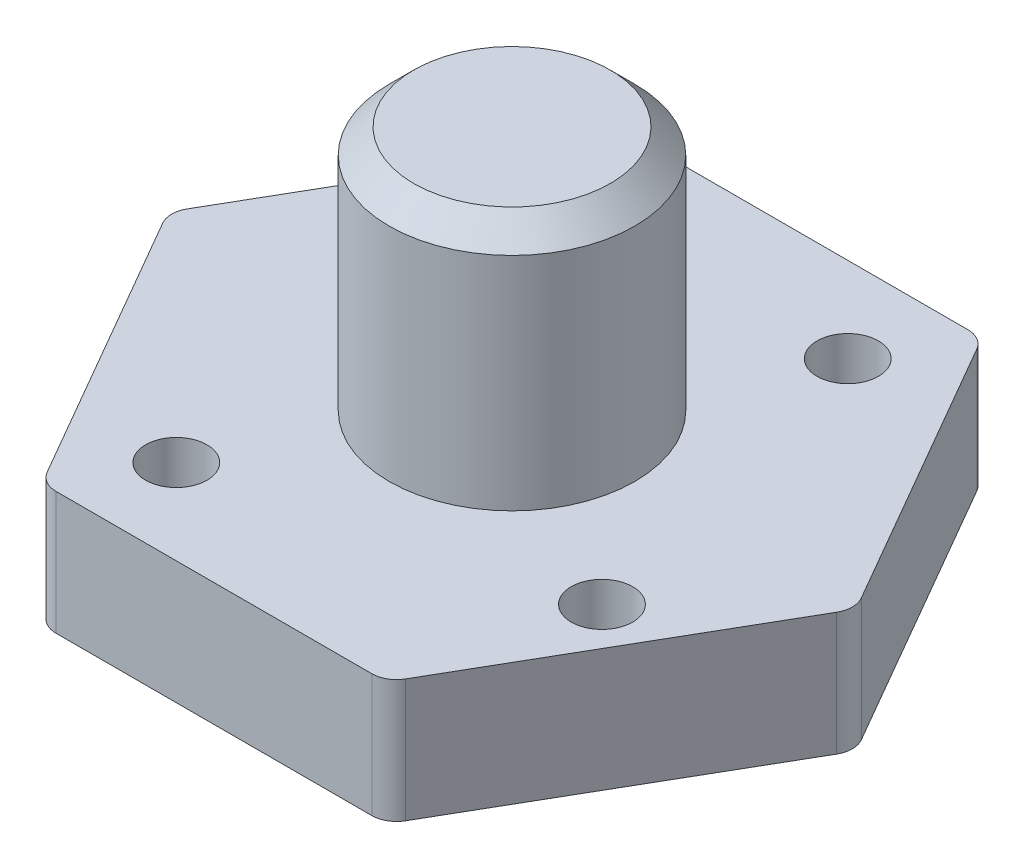
ISO-10303-21;
HEADER;
FILE_DESCRIPTION(('STEP AP214'),'2;1');
FILE_NAME('part.step','',(''),(''),'','','');
FILE_SCHEMA(('AUTOMOTIVE_DESIGN { 1 0 10303 214 1 1 1 1 }'));
ENDSEC;
DATA;
#1=APPLICATION_CONTEXT('core data for automotive mechanical design processes');
#2=APPLICATION_PROTOCOL_DEFINITION('international standard','automotive_design',2000,#1);
#3=PRODUCT_CONTEXT('',#1,'mechanical');
#4=PRODUCT('Part','Part','',(#3));
#5=PRODUCT_RELATED_PRODUCT_CATEGORY('part','',(#4));
#6=PRODUCT_DEFINITION_FORMATION('','',#4);
#7=PRODUCT_DEFINITION_CONTEXT('part definition',#1,'design');
#8=PRODUCT_DEFINITION('design','',#6,#7);
#9=PRODUCT_DEFINITION_SHAPE('','',#8);
#10=(LENGTH_UNIT() NAMED_UNIT(*) SI_UNIT(.MILLI.,.METRE.));
#11=(NAMED_UNIT(*) PLANE_ANGLE_UNIT() SI_UNIT($,.RADIAN.));
#12=(NAMED_UNIT(*) SI_UNIT($,.STERADIAN.) SOLID_ANGLE_UNIT());
#13=UNCERTAINTY_MEASURE_WITH_UNIT(LENGTH_MEASURE(1.E-05),#10,'distance_accuracy_value','');
#14=(GEOMETRIC_REPRESENTATION_CONTEXT(3) GLOBAL_UNCERTAINTY_ASSIGNED_CONTEXT((#13)) GLOBAL_UNIT_ASSIGNED_CONTEXT((#10,
#11,#12)) REPRESENTATION_CONTEXT('',''));
#15=CARTESIAN_POINT('',(0.,0.,0.));
#16=DIRECTION('',(0.,0.,1.));
#17=DIRECTION('',(1.,0.,0.));
#18=AXIS2_PLACEMENT_3D('',#15,#16,#17);
#19=CARTESIAN_POINT('',(0.,5.,0.));
#20=DIRECTION('',(0.,1.,0.));
#21=DIRECTION('',(0.,0.,1.));
#22=AXIS2_PLACEMENT_3D('',#19,#20,#21);
#23=PLANE('',#22);
#24=CARTESIAN_POINT('',(0.,5.,0.));
#25=DIRECTION('',(0.,1.,0.));
#26=DIRECTION('',(0.,0.,1.));
#27=AXIS2_PLACEMENT_3D('',#24,#25,#26);
#28=CIRCLE('',#27,5.);
#29=CARTESIAN_POINT('',(0.,5.,5.));
#30=VERTEX_POINT('',#29);
#31=EDGE_CURVE('E334',#30,#30,#28,.T.);
#32=ORIENTED_EDGE('',*,*,#31,.F.);
#33=EDGE_LOOP('',(#32));
#34=FACE_BOUND('',#33,.T.);
#35=CARTESIAN_POINT('',(-4.99999999999707,5.,8.66025403784609));
#36=DIRECTION('',(0.,1.,0.));
#37=DIRECTION('',(0.,0.,1.));
#38=AXIS2_PLACEMENT_3D('',#35,#36,#37);
#39=CIRCLE('',#38,1.25000000000235);
#40=CARTESIAN_POINT('',(-4.99999999999707,5.,9.91025403784844));
#41=VERTEX_POINT('',#40);
#42=EDGE_CURVE('E331',#41,#41,#39,.T.);
#43=ORIENTED_EDGE('',*,*,#42,.F.);
#44=EDGE_LOOP('',(#43));
#45=FACE_BOUND('',#44,.T.);
#46=CARTESIAN_POINT('',(5.,5.,-8.66025403784439));
#47=DIRECTION('',(0.,1.,0.));
#48=DIRECTION('',(0.,0.,1.));
#49=AXIS2_PLACEMENT_3D('',#46,#47,#48);
#50=CIRCLE('',#49,1.25);
#51=CARTESIAN_POINT('',(5.,5.,-7.41025403784438));
#52=VERTEX_POINT('',#51);
#53=EDGE_CURVE('E306',#52,#52,#50,.T.);
#54=ORIENTED_EDGE('',*,*,#53,.F.);
#55=EDGE_LOOP('',(#54));
#56=FACE_BOUND('',#55,.T.);
#57=DIRECTION('',(-1.,0.,0.));
#58=VECTOR('',#57,1.);
#59=CARTESIAN_POINT('',(6.99999999999997,5.,-12.1243556529822));
#60=LINE('',#59,#58);
#61=CARTESIAN_POINT('',(6.42264973081035,5.,-12.1243556529822));
#62=VERTEX_POINT('',#61);
#63=CARTESIAN_POINT('',(-6.42264973081039,5.,-12.1243556529822));
#64=VERTEX_POINT('',#63);
#65=EDGE_CURVE('E294',#62,#64,#60,.T.);
#66=ORIENTED_EDGE('',*,*,#65,.T.);
#67=CARTESIAN_POINT('',(-6.4226497308104,5.,-11.1243556529822));
#68=DIRECTION('',(0.,1.,0.));
#69=DIRECTION('',(0.,0.,1.));
#70=AXIS2_PLACEMENT_3D('',#67,#68,#69);
#71=CIRCLE('',#70,1.);
#72=CARTESIAN_POINT('',(-7.28867513459483,5.,-11.6243556529822));
#73=VERTEX_POINT('',#72);
#74=EDGE_CURVE('E193',#64,#73,#71,.T.);
#75=ORIENTED_EDGE('',*,*,#74,.T.);
#76=DIRECTION('',(-0.499999999999999,0.,0.866025403784439));
#77=VECTOR('',#76,1.);
#78=CARTESIAN_POINT('',(-7.00000000000002,5.,-12.1243556529822));
#79=LINE('',#78,#77);
#80=CARTESIAN_POINT('',(-13.7113248654052,5.,-0.500000000000007));
#81=VERTEX_POINT('',#80);
#82=EDGE_CURVE('E152',#73,#81,#79,.T.);
#83=ORIENTED_EDGE('',*,*,#82,.T.);
#84=CARTESIAN_POINT('',(-12.8452994616208,5.,0.));
#85=DIRECTION('',(0.,1.,0.));
#86=DIRECTION('',(0.,0.,1.));
#87=AXIS2_PLACEMENT_3D('',#84,#85,#86);
#88=CIRCLE('',#87,1.);
#89=CARTESIAN_POINT('',(-13.7113248654052,5.,0.499999999999993));
#90=VERTEX_POINT('',#89);
#91=EDGE_CURVE('E184',#81,#90,#88,.T.);
#92=ORIENTED_EDGE('',*,*,#91,.T.);
#93=DIRECTION('',(0.5,0.,0.866025403784439));
#94=VECTOR('',#93,1.);
#95=CARTESIAN_POINT('',(-14.,5.,0.));
#96=LINE('',#95,#94);
#97=CARTESIAN_POINT('',(-7.28867513459484,5.,11.6243556529822));
#98=VERTEX_POINT('',#97);
#99=EDGE_CURVE('E303',#90,#98,#96,.T.);
#100=ORIENTED_EDGE('',*,*,#99,.T.);
#101=CARTESIAN_POINT('',(-6.4226497308104,5.,11.1243556529822));
#102=DIRECTION('',(0.,1.,0.));
#103=DIRECTION('',(0.,0.,1.));
#104=AXIS2_PLACEMENT_3D('',#101,#102,#103);
#105=CIRCLE('',#104,1.);
#106=CARTESIAN_POINT('',(-6.4226497308104,5.,12.1243556529822));
#107=VERTEX_POINT('',#106);
#108=EDGE_CURVE('E63',#98,#107,#105,.T.);
#109=ORIENTED_EDGE('',*,*,#108,.T.);
#110=DIRECTION('',(1.,0.,0.));
#111=VECTOR('',#110,1.);
#112=CARTESIAN_POINT('',(-7.00000000000003,5.,12.1243556529822));
#113=LINE('',#112,#111);
#114=CARTESIAN_POINT('',(6.42264973081037,5.,12.1243556529822));
#115=VERTEX_POINT('',#114);
#116=EDGE_CURVE('E171',#107,#115,#113,.T.);
#117=ORIENTED_EDGE('',*,*,#116,.T.);
#118=CARTESIAN_POINT('',(6.42264973081037,5.,11.1243556529822));
#119=DIRECTION('',(0.,1.,0.));
#120=DIRECTION('',(0.,0.,1.));
#121=AXIS2_PLACEMENT_3D('',#118,#119,#120);
#122=CIRCLE('',#121,1.);
#123=CARTESIAN_POINT('',(7.28867513459481,5.,11.6243556529822));
#124=VERTEX_POINT('',#123);
#125=EDGE_CURVE('E187',#115,#124,#122,.T.);
#126=ORIENTED_EDGE('',*,*,#125,.T.);
#127=DIRECTION('',(0.499999999999999,0.,-0.866025403784439));
#128=VECTOR('',#127,1.);
#129=CARTESIAN_POINT('',(6.99999999999999,5.,12.1243556529822));
#130=LINE('',#129,#128);
#131=CARTESIAN_POINT('',(13.7113248654052,5.,0.499999999999997));
#132=VERTEX_POINT('',#131);
#133=EDGE_CURVE('E170',#124,#132,#130,.T.);
#134=ORIENTED_EDGE('',*,*,#133,.T.);
#135=CARTESIAN_POINT('',(12.8452994616207,5.,0.));
#136=DIRECTION('',(0.,1.,0.));
#137=DIRECTION('',(0.,0.,1.));
#138=AXIS2_PLACEMENT_3D('',#135,#136,#137);
#139=CIRCLE('',#138,1.);
#140=CARTESIAN_POINT('',(13.7113248654052,5.,-0.500000000000004));
#141=VERTEX_POINT('',#140);
#142=EDGE_CURVE('E189',#132,#141,#139,.T.);
#143=ORIENTED_EDGE('',*,*,#142,.T.);
#144=DIRECTION('',(-0.5,0.,-0.866025403784439));
#145=VECTOR('',#144,1.);
#146=CARTESIAN_POINT('',(14.,5.,0.));
#147=LINE('',#146,#145);
#148=CARTESIAN_POINT('',(7.28867513459478,5.,-11.6243556529822));
#149=VERTEX_POINT('',#148);
#150=EDGE_CURVE('E291',#141,#149,#147,.T.);
#151=ORIENTED_EDGE('',*,*,#150,.T.);
#152=CARTESIAN_POINT('',(6.42264973081035,5.,-11.1243556529822));
#153=DIRECTION('',(0.,1.,0.));
#154=DIRECTION('',(0.,0.,1.));
#155=AXIS2_PLACEMENT_3D('',#152,#153,#154);
#156=CIRCLE('',#155,1.);
#157=EDGE_CURVE('E191',#149,#62,#156,.T.);
#158=ORIENTED_EDGE('',*,*,#157,.T.);
#159=EDGE_LOOP('',(#66,#75,#83,#92,#100,#109,#117,#126,#134,#143,#151,#158));
#160=FACE_BOUND('',#159,.T.);
#161=CARTESIAN_POINT('',(8.6602540378467,5.,4.99999999999939));
#162=DIRECTION('',(0.,1.,0.));
#163=DIRECTION('',(0.,0.,1.));
#164=AXIS2_PLACEMENT_3D('',#161,#162,#163);
#165=CIRCLE('',#164,1.24999999999993);
#166=CARTESIAN_POINT('',(8.6602540378467,5.,6.24999999999932));
#167=VERTEX_POINT('',#166);
#168=EDGE_CURVE('E322',#167,#167,#165,.T.);
#169=ORIENTED_EDGE('',*,*,#168,.F.);
#170=EDGE_LOOP('',(#169));
#171=FACE_BOUND('',#170,.T.);
#172=CARTESIAN_POINT('',(-8.66025403784378,5.,-4.99999999999768));
#173=DIRECTION('',(0.,1.,0.));
#174=DIRECTION('',(0.,0.,1.));
#175=AXIS2_PLACEMENT_3D('',#172,#173,#174);
#176=CIRCLE('',#175,1.25000000000247);
#177=CARTESIAN_POINT('',(-8.66025403784378,5.,-3.74999999999521));
#178=VERTEX_POINT('',#177);
#179=EDGE_CURVE('E325',#178,#178,#176,.T.);
#180=ORIENTED_EDGE('',*,*,#179,.F.);
#181=EDGE_LOOP('',(#180));
#182=FACE_BOUND('',#181,.T.);
#183=ADVANCED_FACE('F40',(#34,#45,#56,#160,#171,#182),#23,.T.);
#184=CARTESIAN_POINT('',(0.,0.,0.));
#185=DIRECTION('',(0.,1.,0.));
#186=DIRECTION('',(0.,0.,1.));
#187=AXIS2_PLACEMENT_3D('',#184,#185,#186);
#188=PLANE('',#187);
#189=DIRECTION('',(-0.499999999999999,0.,0.866025403784439));
#190=VECTOR('',#189,1.);
#191=CARTESIAN_POINT('',(-7.00000000000002,0.,-12.1243556529822));
#192=LINE('',#191,#190);
#193=CARTESIAN_POINT('',(-7.28867513459483,0.,-11.6243556529822));
#194=VERTEX_POINT('',#193);
#195=CARTESIAN_POINT('',(-13.7113248654052,0.,-0.500000000000007));
#196=VERTEX_POINT('',#195);
#197=EDGE_CURVE('E149',#194,#196,#192,.T.);
#198=ORIENTED_EDGE('',*,*,#197,.F.);
#199=CARTESIAN_POINT('',(-6.4226497308104,0.,-11.1243556529822));
#200=DIRECTION('',(0.,1.,0.));
#201=DIRECTION('',(0.,0.,1.));
#202=AXIS2_PLACEMENT_3D('',#199,#200,#201);
#203=CIRCLE('',#202,1.);
#204=CARTESIAN_POINT('',(-6.42264973081039,0.,-12.1243556529822));
#205=VERTEX_POINT('',#204);
#206=EDGE_CURVE('E132',#194,#205,#203,.F.);
#207=ORIENTED_EDGE('',*,*,#206,.T.);
#208=DIRECTION('',(-1.,0.,0.));
#209=VECTOR('',#208,1.);
#210=CARTESIAN_POINT('',(6.99999999999997,0.,-12.1243556529822));
#211=LINE('',#210,#209);
#212=CARTESIAN_POINT('',(6.42264973081035,0.,-12.1243556529822));
#213=VERTEX_POINT('',#212);
#214=EDGE_CURVE('E160',#213,#205,#211,.T.);
#215=ORIENTED_EDGE('',*,*,#214,.F.);
#216=CARTESIAN_POINT('',(6.42264973081035,0.,-11.1243556529822));
#217=DIRECTION('',(0.,1.,0.));
#218=DIRECTION('',(0.,0.,1.));
#219=AXIS2_PLACEMENT_3D('',#216,#217,#218);
#220=CIRCLE('',#219,1.);
#221=CARTESIAN_POINT('',(7.28867513459478,0.,-11.6243556529822));
#222=VERTEX_POINT('',#221);
#223=EDGE_CURVE('E143',#213,#222,#220,.F.);
#224=ORIENTED_EDGE('',*,*,#223,.T.);
#225=DIRECTION('',(-0.5,0.,-0.866025403784439));
#226=VECTOR('',#225,1.);
#227=CARTESIAN_POINT('',(14.,0.,0.));
#228=LINE('',#227,#226);
#229=CARTESIAN_POINT('',(13.7113248654052,0.,-0.500000000000004));
#230=VERTEX_POINT('',#229);
#231=EDGE_CURVE('E165',#230,#222,#228,.T.);
#232=ORIENTED_EDGE('',*,*,#231,.F.);
#233=CARTESIAN_POINT('',(12.8452994616207,0.,0.));
#234=DIRECTION('',(0.,1.,0.));
#235=DIRECTION('',(0.,0.,1.));
#236=AXIS2_PLACEMENT_3D('',#233,#234,#235);
#237=CIRCLE('',#236,1.);
#238=CARTESIAN_POINT('',(13.7113248654052,0.,0.499999999999997));
#239=VERTEX_POINT('',#238);
#240=EDGE_CURVE('E178',#230,#239,#237,.F.);
#241=ORIENTED_EDGE('',*,*,#240,.T.);
#242=DIRECTION('',(0.499999999999999,0.,-0.866025403784439));
#243=VECTOR('',#242,1.);
#244=CARTESIAN_POINT('',(6.99999999999999,0.,12.1243556529822));
#245=LINE('',#244,#243);
#246=CARTESIAN_POINT('',(7.28867513459481,0.,11.6243556529822));
#247=VERTEX_POINT('',#246);
#248=EDGE_CURVE('E284',#247,#239,#245,.T.);
#249=ORIENTED_EDGE('',*,*,#248,.F.);
#250=CARTESIAN_POINT('',(6.42264973081037,0.,11.1243556529822));
#251=DIRECTION('',(0.,1.,0.));
#252=DIRECTION('',(0.,0.,1.));
#253=AXIS2_PLACEMENT_3D('',#250,#251,#252);
#254=CIRCLE('',#253,1.);
#255=CARTESIAN_POINT('',(6.42264973081037,0.,12.1243556529822));
#256=VERTEX_POINT('',#255);
#257=EDGE_CURVE('E176',#247,#256,#254,.F.);
#258=ORIENTED_EDGE('',*,*,#257,.T.);
#259=DIRECTION('',(1.,0.,0.));
#260=VECTOR('',#259,1.);
#261=CARTESIAN_POINT('',(-7.00000000000003,0.,12.1243556529822));
#262=LINE('',#261,#260);
#263=CARTESIAN_POINT('',(-6.4226497308104,0.,12.1243556529822));
#264=VERTEX_POINT('',#263);
#265=EDGE_CURVE('E163',#264,#256,#262,.T.);
#266=ORIENTED_EDGE('',*,*,#265,.F.);
#267=CARTESIAN_POINT('',(-6.4226497308104,0.,11.1243556529822));
#268=DIRECTION('',(0.,1.,0.));
#269=DIRECTION('',(0.,0.,1.));
#270=AXIS2_PLACEMENT_3D('',#267,#268,#269);
#271=CIRCLE('',#270,1.);
#272=CARTESIAN_POINT('',(-7.28867513459484,0.,11.6243556529822));
#273=VERTEX_POINT('',#272);
#274=EDGE_CURVE('E174',#264,#273,#271,.F.);
#275=ORIENTED_EDGE('',*,*,#274,.T.);
#276=DIRECTION('',(0.5,0.,0.866025403784439));
#277=VECTOR('',#276,1.);
#278=CARTESIAN_POINT('',(-14.,0.,0.));
#279=LINE('',#278,#277);
#280=CARTESIAN_POINT('',(-13.7113248654052,0.,0.499999999999993));
#281=VERTEX_POINT('',#280);
#282=EDGE_CURVE('E159',#281,#273,#279,.T.);
#283=ORIENTED_EDGE('',*,*,#282,.F.);
#284=CARTESIAN_POINT('',(-12.8452994616208,0.,0.));
#285=DIRECTION('',(0.,1.,0.));
#286=DIRECTION('',(0.,0.,1.));
#287=AXIS2_PLACEMENT_3D('',#284,#285,#286);
#288=CIRCLE('',#287,1.);
#289=EDGE_CURVE('E153',#281,#196,#288,.F.);
#290=ORIENTED_EDGE('',*,*,#289,.T.);
#291=EDGE_LOOP('',(#198,#207,#215,#224,#232,#241,#249,#258,#266,#275,#283,#290));
#292=FACE_BOUND('',#291,.T.);
#293=CARTESIAN_POINT('',(5.,0.,-8.66025403784439));
#294=DIRECTION('',(0.,1.,0.));
#295=DIRECTION('',(0.,0.,1.));
#296=AXIS2_PLACEMENT_3D('',#293,#294,#295);
#297=CIRCLE('',#296,1.25);
#298=CARTESIAN_POINT('',(5.,0.,-7.41025403784438));
#299=VERTEX_POINT('',#298);
#300=EDGE_CURVE('E297',#299,#299,#297,.T.);
#301=ORIENTED_EDGE('',*,*,#300,.T.);
#302=EDGE_LOOP('',(#301));
#303=FACE_BOUND('',#302,.T.);
#304=CARTESIAN_POINT('',(8.6602540378467,0.,4.99999999999939));
#305=DIRECTION('',(0.,1.,0.));
#306=DIRECTION('',(0.,0.,1.));
#307=AXIS2_PLACEMENT_3D('',#304,#305,#306);
#308=CIRCLE('',#307,1.24999999999993);
#309=CARTESIAN_POINT('',(8.6602540378467,0.,6.24999999999932));
#310=VERTEX_POINT('',#309);
#311=EDGE_CURVE('E339',#310,#310,#308,.T.);
#312=ORIENTED_EDGE('',*,*,#311,.T.);
#313=EDGE_LOOP('',(#312));
#314=FACE_BOUND('',#313,.T.);
#315=CARTESIAN_POINT('',(-4.99999999999707,0.,8.66025403784609));
#316=DIRECTION('',(0.,1.,0.));
#317=DIRECTION('',(0.,0.,1.));
#318=AXIS2_PLACEMENT_3D('',#315,#316,#317);
#319=CIRCLE('',#318,1.25000000000235);
#320=CARTESIAN_POINT('',(-4.99999999999707,0.,9.91025403784844));
#321=VERTEX_POINT('',#320);
#322=EDGE_CURVE('E327',#321,#321,#319,.T.);
#323=ORIENTED_EDGE('',*,*,#322,.T.);
#324=EDGE_LOOP('',(#323));
#325=FACE_BOUND('',#324,.T.);
#326=CARTESIAN_POINT('',(-8.66025403784378,0.,-4.99999999999768));
#327=DIRECTION('',(0.,1.,0.));
#328=DIRECTION('',(0.,0.,1.));
#329=AXIS2_PLACEMENT_3D('',#326,#327,#328);
#330=CIRCLE('',#329,1.25000000000247);
#331=CARTESIAN_POINT('',(-8.66025403784378,0.,-3.74999999999521));
#332=VERTEX_POINT('',#331);
#333=EDGE_CURVE('E328',#332,#332,#330,.T.);
#334=ORIENTED_EDGE('',*,*,#333,.T.);
#335=EDGE_LOOP('',(#334));
#336=FACE_BOUND('',#335,.T.);
#337=ADVANCED_FACE('F156',(#292,#303,#314,#325,#336),#188,.F.);
#338=CARTESIAN_POINT('',(6.99999999999999,5.,12.1243556529822));
#339=DIRECTION('',(-0.866025403784439,0.,-0.5));
#340=DIRECTION('',(-0.5,0.,0.866025403784439));
#341=AXIS2_PLACEMENT_3D('',#338,#339,#340);
#342=PLANE('',#341);
#343=ORIENTED_EDGE('',*,*,#248,.T.);
#344=DIRECTION('',(0.,-1.,0.));
#345=VECTOR('',#344,1.);
#346=CARTESIAN_POINT('',(13.7113248654052,5.,0.499999999999997));
#347=LINE('',#346,#345);
#348=EDGE_CURVE('E203',#239,#132,#347,.F.);
#349=ORIENTED_EDGE('',*,*,#348,.T.);
#350=ORIENTED_EDGE('',*,*,#133,.F.);
#351=DIRECTION('',(0.,-1.,0.));
#352=VECTOR('',#351,1.);
#353=CARTESIAN_POINT('',(7.28867513459481,5.,11.6243556529822));
#354=LINE('',#353,#352);
#355=EDGE_CURVE('E200',#124,#247,#354,.T.);
#356=ORIENTED_EDGE('',*,*,#355,.T.);
#357=EDGE_LOOP('',(#343,#349,#350,#356));
#358=FACE_BOUND('',#357,.T.);
#359=ADVANCED_FACE('F233',(#358),#342,.F.);
#360=CARTESIAN_POINT('',(14.,5.,0.));
#361=DIRECTION('',(-0.866025403784439,0.,0.5));
#362=DIRECTION('',(0.5,0.,0.866025403784439));
#363=AXIS2_PLACEMENT_3D('',#360,#361,#362);
#364=PLANE('',#363);
#365=ORIENTED_EDGE('',*,*,#231,.T.);
#366=DIRECTION('',(0.,-1.,0.));
#367=VECTOR('',#366,1.);
#368=CARTESIAN_POINT('',(7.28867513459478,5.,-11.6243556529822));
#369=LINE('',#368,#367);
#370=EDGE_CURVE('E198',#222,#149,#369,.F.);
#371=ORIENTED_EDGE('',*,*,#370,.T.);
#372=ORIENTED_EDGE('',*,*,#150,.F.);
#373=DIRECTION('',(0.,-1.,0.));
#374=VECTOR('',#373,1.);
#375=CARTESIAN_POINT('',(13.7113248654052,5.,-0.500000000000004));
#376=LINE('',#375,#374);
#377=EDGE_CURVE('E195',#141,#230,#376,.T.);
#378=ORIENTED_EDGE('',*,*,#377,.T.);
#379=EDGE_LOOP('',(#365,#371,#372,#378));
#380=FACE_BOUND('',#379,.T.);
#381=ADVANCED_FACE('F253',(#380),#364,.F.);
#382=CARTESIAN_POINT('',(6.99999999999997,5.,-12.1243556529822));
#383=DIRECTION('',(0.,0.,1.));
#384=DIRECTION('',(1.,0.,0.));
#385=AXIS2_PLACEMENT_3D('',#382,#383,#384);
#386=PLANE('',#385);
#387=ORIENTED_EDGE('',*,*,#214,.T.);
#388=DIRECTION('',(0.,-1.,0.));
#389=VECTOR('',#388,1.);
#390=CARTESIAN_POINT('',(-6.42264973081039,5.,-12.1243556529822));
#391=LINE('',#390,#389);
#392=EDGE_CURVE('E137',#205,#64,#391,.F.);
#393=ORIENTED_EDGE('',*,*,#392,.T.);
#394=ORIENTED_EDGE('',*,*,#65,.F.);
#395=DIRECTION('',(0.,-1.,0.));
#396=VECTOR('',#395,1.);
#397=CARTESIAN_POINT('',(6.42264973081035,5.,-12.1243556529822));
#398=LINE('',#397,#396);
#399=EDGE_CURVE('E142',#62,#213,#398,.T.);
#400=ORIENTED_EDGE('',*,*,#399,.T.);
#401=EDGE_LOOP('',(#387,#393,#394,#400));
#402=FACE_BOUND('',#401,.T.);
#403=ADVANCED_FACE('F250',(#402),#386,.F.);
#404=CARTESIAN_POINT('',(-7.00000000000002,5.,-12.1243556529822));
#405=DIRECTION('',(0.866025403784439,0.,0.5));
#406=DIRECTION('',(0.5,0.,-0.866025403784439));
#407=AXIS2_PLACEMENT_3D('',#404,#405,#406);
#408=PLANE('',#407);
#409=ORIENTED_EDGE('',*,*,#82,.F.);
#410=DIRECTION('',(0.,-1.,0.));
#411=VECTOR('',#410,1.);
#412=CARTESIAN_POINT('',(-7.28867513459483,5.,-11.6243556529822));
#413=LINE('',#412,#411);
#414=EDGE_CURVE('E136',#73,#194,#413,.T.);
#415=ORIENTED_EDGE('',*,*,#414,.T.);
#416=ORIENTED_EDGE('',*,*,#197,.T.);
#417=DIRECTION('',(0.,-1.,0.));
#418=VECTOR('',#417,1.);
#419=CARTESIAN_POINT('',(-13.7113248654052,5.,-0.500000000000007));
#420=LINE('',#419,#418);
#421=EDGE_CURVE('E154',#196,#81,#420,.F.);
#422=ORIENTED_EDGE('',*,*,#421,.T.);
#423=EDGE_LOOP('',(#409,#415,#416,#422));
#424=FACE_BOUND('',#423,.T.);
#425=ADVANCED_FACE('F148',(#424),#408,.F.);
#426=CARTESIAN_POINT('',(-14.,5.,0.));
#427=DIRECTION('',(0.866025403784439,0.,-0.5));
#428=DIRECTION('',(-0.5,0.,-0.866025403784439));
#429=AXIS2_PLACEMENT_3D('',#426,#427,#428);
#430=PLANE('',#429);
#431=ORIENTED_EDGE('',*,*,#282,.T.);
#432=DIRECTION('',(0.,-1.,0.));
#433=VECTOR('',#432,1.);
#434=CARTESIAN_POINT('',(-7.28867513459484,5.,11.6243556529822));
#435=LINE('',#434,#433);
#436=EDGE_CURVE('E212',#273,#98,#435,.F.);
#437=ORIENTED_EDGE('',*,*,#436,.T.);
#438=ORIENTED_EDGE('',*,*,#99,.F.);
#439=DIRECTION('',(0.,-1.,0.));
#440=VECTOR('',#439,1.);
#441=CARTESIAN_POINT('',(-13.7113248654052,5.,0.499999999999993));
#442=LINE('',#441,#440);
#443=EDGE_CURVE('E209',#90,#281,#442,.T.);
#444=ORIENTED_EDGE('',*,*,#443,.T.);
#445=EDGE_LOOP('',(#431,#437,#438,#444));
#446=FACE_BOUND('',#445,.T.);
#447=ADVANCED_FACE('F244',(#446),#430,.F.);
#448=CARTESIAN_POINT('',(-7.00000000000003,5.,12.1243556529822));
#449=DIRECTION('',(0.,0.,-1.));
#450=DIRECTION('',(-1.,0.,0.));
#451=AXIS2_PLACEMENT_3D('',#448,#449,#450);
#452=PLANE('',#451);
#453=ORIENTED_EDGE('',*,*,#265,.T.);
#454=DIRECTION('',(0.,-1.,0.));
#455=VECTOR('',#454,1.);
#456=CARTESIAN_POINT('',(6.42264973081037,5.,12.1243556529822));
#457=LINE('',#456,#455);
#458=EDGE_CURVE('E56',#256,#115,#457,.F.);
#459=ORIENTED_EDGE('',*,*,#458,.T.);
#460=ORIENTED_EDGE('',*,*,#116,.F.);
#461=DIRECTION('',(0.,-1.,0.));
#462=VECTOR('',#461,1.);
#463=CARTESIAN_POINT('',(-6.4226497308104,5.,12.1243556529822));
#464=LINE('',#463,#462);
#465=EDGE_CURVE('E205',#107,#264,#464,.T.);
#466=ORIENTED_EDGE('',*,*,#465,.T.);
#467=EDGE_LOOP('',(#453,#459,#460,#466));
#468=FACE_BOUND('',#467,.T.);
#469=ADVANCED_FACE('F241',(#468),#452,.F.);
#470=CARTESIAN_POINT('',(5.,5.,-8.66025403784439));
#471=DIRECTION('',(0.,-1.,0.));
#472=DIRECTION('',(0.,0.,-1.));
#473=AXIS2_PLACEMENT_3D('',#470,#471,#472);
#474=CYLINDRICAL_SURFACE('',#473,1.25);
#475=ORIENTED_EDGE('',*,*,#53,.T.);
#476=EDGE_LOOP('',(#475));
#477=FACE_BOUND('',#476,.T.);
#478=ORIENTED_EDGE('',*,*,#300,.F.);
#479=EDGE_LOOP('',(#478));
#480=FACE_BOUND('',#479,.T.);
#481=ADVANCED_FACE('F238',(#477,#480),#474,.F.);
#482=CARTESIAN_POINT('',(8.6602540378467,5.,4.99999999999939));
#483=DIRECTION('',(0.,-1.,0.));
#484=DIRECTION('',(0.,0.,-1.));
#485=AXIS2_PLACEMENT_3D('',#482,#483,#484);
#486=CYLINDRICAL_SURFACE('',#485,1.24999999999993);
#487=ORIENTED_EDGE('',*,*,#168,.T.);
#488=EDGE_LOOP('',(#487));
#489=FACE_BOUND('',#488,.T.);
#490=ORIENTED_EDGE('',*,*,#311,.F.);
#491=EDGE_LOOP('',(#490));
#492=FACE_BOUND('',#491,.T.);
#493=ADVANCED_FACE('F351',(#489,#492),#486,.F.);
#494=CARTESIAN_POINT('',(-4.99999999999707,5.,8.66025403784609));
#495=DIRECTION('',(0.,-1.,0.));
#496=DIRECTION('',(0.,0.,-1.));
#497=AXIS2_PLACEMENT_3D('',#494,#495,#496);
#498=CYLINDRICAL_SURFACE('',#497,1.25000000000235);
#499=ORIENTED_EDGE('',*,*,#42,.T.);
#500=EDGE_LOOP('',(#499));
#501=FACE_BOUND('',#500,.T.);
#502=ORIENTED_EDGE('',*,*,#322,.F.);
#503=EDGE_LOOP('',(#502));
#504=FACE_BOUND('',#503,.T.);
#505=ADVANCED_FACE('F355',(#501,#504),#498,.F.);
#506=CARTESIAN_POINT('',(-8.66025403784378,5.,-4.99999999999768));
#507=DIRECTION('',(0.,-1.,0.));
#508=DIRECTION('',(0.,0.,-1.));
#509=AXIS2_PLACEMENT_3D('',#506,#507,#508);
#510=CYLINDRICAL_SURFACE('',#509,1.25000000000247);
#511=ORIENTED_EDGE('',*,*,#179,.T.);
#512=EDGE_LOOP('',(#511));
#513=FACE_BOUND('',#512,.T.);
#514=ORIENTED_EDGE('',*,*,#333,.F.);
#515=EDGE_LOOP('',(#514));
#516=FACE_BOUND('',#515,.T.);
#517=ADVANCED_FACE('F360',(#513,#516),#510,.F.);
#518=CARTESIAN_POINT('',(0.,15.,0.));
#519=DIRECTION('',(0.,-1.,0.));
#520=DIRECTION('',(0.,0.,-1.));
#521=AXIS2_PLACEMENT_3D('',#518,#519,#520);
#522=CYLINDRICAL_SURFACE('',#521,5.);
#523=CARTESIAN_POINT('',(0.,14.,0.));
#524=DIRECTION('',(0.,1.,0.));
#525=DIRECTION('',(0.,0.,1.));
#526=AXIS2_PLACEMENT_3D('',#523,#524,#525);
#527=CIRCLE('',#526,5.);
#528=CARTESIAN_POINT('',(0.,14.,5.));
#529=VERTEX_POINT('',#528);
#530=EDGE_CURVE('E11',#529,#529,#527,.F.);
#531=ORIENTED_EDGE('',*,*,#530,.T.);
#532=EDGE_LOOP('',(#531));
#533=FACE_BOUND('',#532,.T.);
#534=ORIENTED_EDGE('',*,*,#31,.T.);
#535=EDGE_LOOP('',(#534));
#536=FACE_BOUND('',#535,.T.);
#537=ADVANCED_FACE('F367',(#533,#536),#522,.T.);
#538=CARTESIAN_POINT('',(0.,15.,0.));
#539=DIRECTION('',(0.,1.,0.));
#540=DIRECTION('',(0.,0.,1.));
#541=AXIS2_PLACEMENT_3D('',#538,#539,#540);
#542=PLANE('',#541);
#543=CARTESIAN_POINT('',(0.,15.,0.));
#544=DIRECTION('',(0.,1.,0.));
#545=DIRECTION('',(0.,0.,1.));
#546=AXIS2_PLACEMENT_3D('',#543,#544,#545);
#547=CIRCLE('',#546,4.);
#548=CARTESIAN_POINT('',(0.,15.,4.));
#549=VERTEX_POINT('',#548);
#550=EDGE_CURVE('E49',#549,#549,#547,.T.);
#551=ORIENTED_EDGE('',*,*,#550,.T.);
#552=EDGE_LOOP('',(#551));
#553=FACE_BOUND('',#552,.T.);
#554=ADVANCED_FACE('F216',(#553),#542,.T.);
#555=CARTESIAN_POINT('',(-6.4226497308104,5.,-11.1243556529822));
#556=DIRECTION('',(0.,-1.,0.));
#557=DIRECTION('',(0.,0.,-1.));
#558=AXIS2_PLACEMENT_3D('',#555,#556,#557);
#559=CYLINDRICAL_SURFACE('',#558,1.);
#560=ORIENTED_EDGE('',*,*,#74,.F.);
#561=ORIENTED_EDGE('',*,*,#392,.F.);
#562=ORIENTED_EDGE('',*,*,#206,.F.);
#563=ORIENTED_EDGE('',*,*,#414,.F.);
#564=EDGE_LOOP('',(#560,#561,#562,#563));
#565=FACE_BOUND('',#564,.T.);
#566=ADVANCED_FACE('F135',(#565),#559,.T.);
#567=CARTESIAN_POINT('',(6.42264973081035,5.,-11.1243556529822));
#568=DIRECTION('',(0.,-1.,0.));
#569=DIRECTION('',(0.,0.,-1.));
#570=AXIS2_PLACEMENT_3D('',#567,#568,#569);
#571=CYLINDRICAL_SURFACE('',#570,1.);
#572=ORIENTED_EDGE('',*,*,#157,.F.);
#573=ORIENTED_EDGE('',*,*,#370,.F.);
#574=ORIENTED_EDGE('',*,*,#223,.F.);
#575=ORIENTED_EDGE('',*,*,#399,.F.);
#576=EDGE_LOOP('',(#572,#573,#574,#575));
#577=FACE_BOUND('',#576,.T.);
#578=ADVANCED_FACE('F263',(#577),#571,.T.);
#579=CARTESIAN_POINT('',(12.8452994616207,5.,0.));
#580=DIRECTION('',(0.,-1.,0.));
#581=DIRECTION('',(0.,0.,-1.));
#582=AXIS2_PLACEMENT_3D('',#579,#580,#581);
#583=CYLINDRICAL_SURFACE('',#582,1.);
#584=ORIENTED_EDGE('',*,*,#142,.F.);
#585=ORIENTED_EDGE('',*,*,#348,.F.);
#586=ORIENTED_EDGE('',*,*,#240,.F.);
#587=ORIENTED_EDGE('',*,*,#377,.F.);
#588=EDGE_LOOP('',(#584,#585,#586,#587));
#589=FACE_BOUND('',#588,.T.);
#590=ADVANCED_FACE('F266',(#589),#583,.T.);
#591=CARTESIAN_POINT('',(6.42264973081037,5.,11.1243556529822));
#592=DIRECTION('',(0.,-1.,0.));
#593=DIRECTION('',(0.,0.,-1.));
#594=AXIS2_PLACEMENT_3D('',#591,#592,#593);
#595=CYLINDRICAL_SURFACE('',#594,1.);
#596=ORIENTED_EDGE('',*,*,#125,.F.);
#597=ORIENTED_EDGE('',*,*,#458,.F.);
#598=ORIENTED_EDGE('',*,*,#257,.F.);
#599=ORIENTED_EDGE('',*,*,#355,.F.);
#600=EDGE_LOOP('',(#596,#597,#598,#599));
#601=FACE_BOUND('',#600,.T.);
#602=ADVANCED_FACE('F270',(#601),#595,.T.);
#603=CARTESIAN_POINT('',(-6.4226497308104,5.,11.1243556529822));
#604=DIRECTION('',(0.,-1.,0.));
#605=DIRECTION('',(0.,0.,-1.));
#606=AXIS2_PLACEMENT_3D('',#603,#604,#605);
#607=CYLINDRICAL_SURFACE('',#606,1.);
#608=ORIENTED_EDGE('',*,*,#108,.F.);
#609=ORIENTED_EDGE('',*,*,#436,.F.);
#610=ORIENTED_EDGE('',*,*,#274,.F.);
#611=ORIENTED_EDGE('',*,*,#465,.F.);
#612=EDGE_LOOP('',(#608,#609,#610,#611));
#613=FACE_BOUND('',#612,.T.);
#614=ADVANCED_FACE('F224',(#613),#607,.T.);
#615=CARTESIAN_POINT('',(-12.8452994616208,5.,0.));
#616=DIRECTION('',(0.,-1.,0.));
#617=DIRECTION('',(0.,0.,-1.));
#618=AXIS2_PLACEMENT_3D('',#615,#616,#617);
#619=CYLINDRICAL_SURFACE('',#618,1.);
#620=ORIENTED_EDGE('',*,*,#91,.F.);
#621=ORIENTED_EDGE('',*,*,#421,.F.);
#622=ORIENTED_EDGE('',*,*,#289,.F.);
#623=ORIENTED_EDGE('',*,*,#443,.F.);
#624=EDGE_LOOP('',(#620,#621,#622,#623));
#625=FACE_BOUND('',#624,.T.);
#626=ADVANCED_FACE('F219',(#625),#619,.T.);
#627=CARTESIAN_POINT('',(0.,15.,0.));
#628=DIRECTION('',(0.,-1.,0.));
#629=DIRECTION('',(0.,0.,-1.));
#630=AXIS2_PLACEMENT_3D('',#627,#628,#629);
#631=CONICAL_SURFACE('',#630,4.,0.785398163397445);
#632=ORIENTED_EDGE('',*,*,#530,.F.);
#633=EDGE_LOOP('',(#632));
#634=FACE_BOUND('',#633,.T.);
#635=ORIENTED_EDGE('',*,*,#550,.F.);
#636=EDGE_LOOP('',(#635));
#637=FACE_BOUND('',#636,.T.);
#638=ADVANCED_FACE('F43',(#634,#637),#631,.T.);
#639=CLOSED_SHELL('',(#183,#337,#359,#381,#403,#425,#447,#469,#481,#493,#505,#517,#537,#554,
#566,#578,#590,#602,#614,#626,#638));
#640=MANIFOLD_SOLID_BREP('B2',#639);
#641=ADVANCED_BREP_SHAPE_REPRESENTATION('',(#18,#640),#14);
#642=SHAPE_DEFINITION_REPRESENTATION(#9,#641);
ENDSEC;
END-ISO-10303-21;
